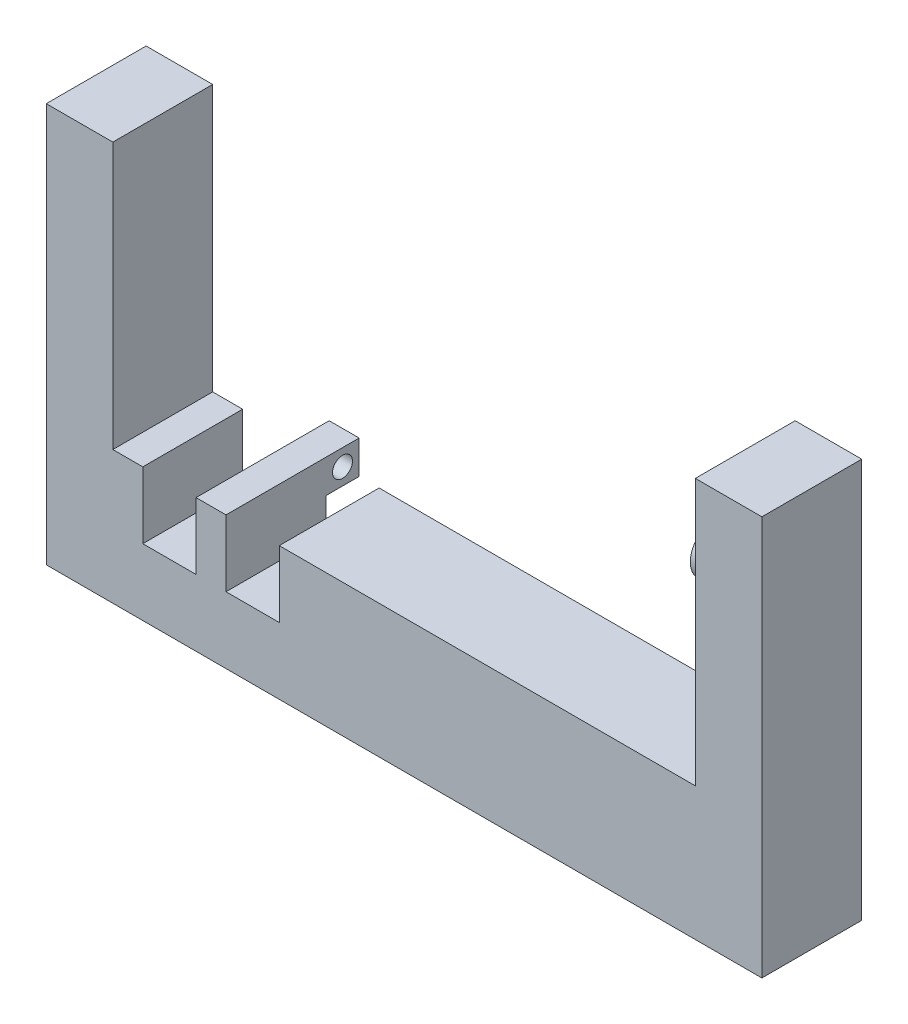
ISO-10303-21;
HEADER;
FILE_DESCRIPTION(('STEP AP214'),'2;1');
FILE_NAME('part.step','',(''),(''),'','','');
FILE_SCHEMA(('AUTOMOTIVE_DESIGN { 1 0 10303 214 1 1 1 1 }'));
ENDSEC;
DATA;
#1=APPLICATION_CONTEXT('core data for automotive mechanical design processes');
#2=APPLICATION_PROTOCOL_DEFINITION('international standard','automotive_design',2000,#1);
#3=PRODUCT_CONTEXT('',#1,'mechanical');
#4=PRODUCT('Part','Part','',(#3));
#5=PRODUCT_RELATED_PRODUCT_CATEGORY('part','',(#4));
#6=PRODUCT_DEFINITION_FORMATION('','',#4);
#7=PRODUCT_DEFINITION_CONTEXT('part definition',#1,'design');
#8=PRODUCT_DEFINITION('design','',#6,#7);
#9=PRODUCT_DEFINITION_SHAPE('','',#8);
#10=(LENGTH_UNIT() NAMED_UNIT(*) SI_UNIT(.MILLI.,.METRE.));
#11=(NAMED_UNIT(*) PLANE_ANGLE_UNIT() SI_UNIT($,.RADIAN.));
#12=(NAMED_UNIT(*) SI_UNIT($,.STERADIAN.) SOLID_ANGLE_UNIT());
#13=UNCERTAINTY_MEASURE_WITH_UNIT(LENGTH_MEASURE(1.E-05),#10,'distance_accuracy_value','');
#14=(GEOMETRIC_REPRESENTATION_CONTEXT(3) GLOBAL_UNCERTAINTY_ASSIGNED_CONTEXT((#13)) GLOBAL_UNIT_ASSIGNED_CONTEXT((#10,
#11,#12)) REPRESENTATION_CONTEXT('',''));
#15=CARTESIAN_POINT('',(0.,0.,0.));
#16=DIRECTION('',(0.,0.,1.));
#17=DIRECTION('',(1.,0.,0.));
#18=AXIS2_PLACEMENT_3D('',#15,#16,#17);
#19=CARTESIAN_POINT('',(-103.,10.,-7.5));
#20=DIRECTION('',(0.,0.,-1.));
#21=DIRECTION('',(1.,0.,0.));
#22=AXIS2_PLACEMENT_3D('',#19,#20,#21);
#23=PLANE('',#22);
#24=DIRECTION('',(1.,0.,0.));
#25=VECTOR('',#24,1.);
#26=CARTESIAN_POINT('',(-136.5,15.,-7.5));
#27=LINE('',#26,#25);
#28=CARTESIAN_POINT('',(-136.5,15.,-7.5));
#29=VERTEX_POINT('',#28);
#30=CARTESIAN_POINT('',(-132.,15.,-7.5));
#31=VERTEX_POINT('',#30);
#32=EDGE_CURVE('E226',#29,#31,#27,.T.);
#33=ORIENTED_EDGE('',*,*,#32,.T.);
#34=DIRECTION('',(0.,-1.,0.));
#35=VECTOR('',#34,1.);
#36=CARTESIAN_POINT('',(-132.,20.,-7.5));
#37=LINE('',#36,#35);
#38=CARTESIAN_POINT('',(-132.,10.,-7.5));
#39=VERTEX_POINT('',#38);
#40=EDGE_CURVE('E295',#31,#39,#37,.T.);
#41=ORIENTED_EDGE('',*,*,#40,.T.);
#42=DIRECTION('',(-1.,0.,0.));
#43=VECTOR('',#42,1.);
#44=CARTESIAN_POINT('',(-103.,10.,-7.5));
#45=LINE('',#44,#43);
#46=CARTESIAN_POINT('',(-124.,10.,-7.5));
#47=VERTEX_POINT('',#46);
#48=EDGE_CURVE('E273',#47,#39,#45,.T.);
#49=ORIENTED_EDGE('',*,*,#48,.F.);
#50=DIRECTION('',(0.,-1.,0.));
#51=VECTOR('',#50,1.);
#52=CARTESIAN_POINT('',(-124.,20.,-7.5));
#53=LINE('',#52,#51);
#54=CARTESIAN_POINT('',(-124.,20.,-7.5));
#55=VERTEX_POINT('',#54);
#56=EDGE_CURVE('E270',#55,#47,#53,.T.);
#57=ORIENTED_EDGE('',*,*,#56,.F.);
#58=DIRECTION('',(-1.,0.,0.));
#59=VECTOR('',#58,1.);
#60=CARTESIAN_POINT('',(-103.,20.,-7.5));
#61=LINE('',#60,#59);
#62=CARTESIAN_POINT('',(-61.5,20.,-7.5));
#63=VERTEX_POINT('',#62);
#64=EDGE_CURVE('E259',#63,#55,#61,.T.);
#65=ORIENTED_EDGE('',*,*,#64,.F.);
#66=DIRECTION('',(0.,-1.,0.));
#67=VECTOR('',#66,1.);
#68=CARTESIAN_POINT('',(-61.5,60.,-7.5));
#69=LINE('',#68,#67);
#70=CARTESIAN_POINT('',(-61.5,60.,-7.5));
#71=VERTEX_POINT('',#70);
#72=EDGE_CURVE('E202',#71,#63,#69,.T.);
#73=ORIENTED_EDGE('',*,*,#72,.F.);
#74=DIRECTION('',(1.,0.,0.));
#75=VECTOR('',#74,1.);
#76=CARTESIAN_POINT('',(-103.,60.,-7.5));
#77=LINE('',#76,#75);
#78=CARTESIAN_POINT('',(-51.5,60.,-7.5));
#79=VERTEX_POINT('',#78);
#80=EDGE_CURVE('E316',#71,#79,#77,.T.);
#81=ORIENTED_EDGE('',*,*,#80,.T.);
#82=DIRECTION('',(0.,-1.,0.));
#83=VECTOR('',#82,1.);
#84=CARTESIAN_POINT('',(-51.5,60.,-7.5));
#85=LINE('',#84,#83);
#86=CARTESIAN_POINT('',(-51.5,0.,-7.5));
#87=VERTEX_POINT('',#86);
#88=EDGE_CURVE('E179',#79,#87,#85,.T.);
#89=ORIENTED_EDGE('',*,*,#88,.T.);
#90=DIRECTION('',(-1.,0.,0.));
#91=VECTOR('',#90,1.);
#92=CARTESIAN_POINT('',(-103.,0.,-7.5));
#93=LINE('',#92,#91);
#94=CARTESIAN_POINT('',(-159.,0.,-7.5));
#95=VERTEX_POINT('',#94);
#96=EDGE_CURVE('E298',#87,#95,#93,.T.);
#97=ORIENTED_EDGE('',*,*,#96,.T.);
#98=DIRECTION('',(0.,-1.,0.));
#99=VECTOR('',#98,1.);
#100=CARTESIAN_POINT('',(-159.,60.,-7.5));
#101=LINE('',#100,#99);
#102=CARTESIAN_POINT('',(-159.,60.,-7.5));
#103=VERTEX_POINT('',#102);
#104=EDGE_CURVE('E221',#103,#95,#101,.T.);
#105=ORIENTED_EDGE('',*,*,#104,.F.);
#106=DIRECTION('',(-1.,0.,0.));
#107=VECTOR('',#106,1.);
#108=CARTESIAN_POINT('',(-103.,60.,-7.50000000000001));
#109=LINE('',#108,#107);
#110=CARTESIAN_POINT('',(-149.,60.,-7.5));
#111=VERTEX_POINT('',#110);
#112=EDGE_CURVE('E210',#111,#103,#109,.T.);
#113=ORIENTED_EDGE('',*,*,#112,.F.);
#114=DIRECTION('',(0.,-1.,0.));
#115=VECTOR('',#114,1.);
#116=CARTESIAN_POINT('',(-149.,60.,-7.5));
#117=LINE('',#116,#115);
#118=CARTESIAN_POINT('',(-149.,20.,-7.5));
#119=VERTEX_POINT('',#118);
#120=EDGE_CURVE('E218',#111,#119,#117,.T.);
#121=ORIENTED_EDGE('',*,*,#120,.T.);
#122=DIRECTION('',(-1.,0.,0.));
#123=VECTOR('',#122,1.);
#124=CARTESIAN_POINT('',(-103.,20.,-7.49999999999995));
#125=LINE('',#124,#123);
#126=CARTESIAN_POINT('',(-144.5,20.,-7.5));
#127=VERTEX_POINT('',#126);
#128=EDGE_CURVE('E246',#127,#119,#125,.T.);
#129=ORIENTED_EDGE('',*,*,#128,.F.);
#130=DIRECTION('',(0.,-1.,0.));
#131=VECTOR('',#130,1.);
#132=CARTESIAN_POINT('',(-144.5,20.,-7.5));
#133=LINE('',#132,#131);
#134=CARTESIAN_POINT('',(-144.5,10.,-7.5));
#135=VERTEX_POINT('',#134);
#136=EDGE_CURVE('E254',#127,#135,#133,.T.);
#137=ORIENTED_EDGE('',*,*,#136,.T.);
#138=DIRECTION('',(-1.,0.,0.));
#139=VECTOR('',#138,1.);
#140=CARTESIAN_POINT('',(-103.,10.,-7.5));
#141=LINE('',#140,#139);
#142=CARTESIAN_POINT('',(-136.5,10.,-7.5));
#143=VERTEX_POINT('',#142);
#144=EDGE_CURVE('E301',#143,#135,#141,.T.);
#145=ORIENTED_EDGE('',*,*,#144,.F.);
#146=DIRECTION('',(0.,-1.,0.));
#147=VECTOR('',#146,1.);
#148=CARTESIAN_POINT('',(-136.5,20.,-7.5));
#149=LINE('',#148,#147);
#150=EDGE_CURVE('E288',#29,#143,#149,.T.);
#151=ORIENTED_EDGE('',*,*,#150,.F.);
#152=EDGE_LOOP('',(#33,#41,#49,#57,#65,#73,#81,#89,#97,#105,#113,#121,#129,#137,#145,#151));
#153=FACE_BOUND('',#152,.T.);
#154=ADVANCED_FACE('F43',(#153),#23,.T.);
#155=CARTESIAN_POINT('',(-103.,10.,7.5));
#156=DIRECTION('',(0.,0.,-1.));
#157=DIRECTION('',(1.,0.,0.));
#158=AXIS2_PLACEMENT_3D('',#155,#156,#157);
#159=PLANE('',#158);
#160=DIRECTION('',(-1.,0.,0.));
#161=VECTOR('',#160,1.);
#162=CARTESIAN_POINT('',(-103.,0.,7.5));
#163=LINE('',#162,#161);
#164=CARTESIAN_POINT('',(-51.5,0.,7.5));
#165=VERTEX_POINT('',#164);
#166=CARTESIAN_POINT('',(-159.,0.,7.5));
#167=VERTEX_POINT('',#166);
#168=EDGE_CURVE('E196',#165,#167,#163,.T.);
#169=ORIENTED_EDGE('',*,*,#168,.F.);
#170=DIRECTION('',(0.,-1.,0.));
#171=VECTOR('',#170,1.);
#172=CARTESIAN_POINT('',(-51.5,60.,7.5));
#173=LINE('',#172,#171);
#174=CARTESIAN_POINT('',(-51.5,60.,7.5));
#175=VERTEX_POINT('',#174);
#176=EDGE_CURVE('E176',#175,#165,#173,.T.);
#177=ORIENTED_EDGE('',*,*,#176,.F.);
#178=DIRECTION('',(-1.,0.,0.));
#179=VECTOR('',#178,1.);
#180=CARTESIAN_POINT('',(-103.,60.,7.5));
#181=LINE('',#180,#179);
#182=CARTESIAN_POINT('',(-61.5,60.,7.5));
#183=VERTEX_POINT('',#182);
#184=EDGE_CURVE('E183',#175,#183,#181,.T.);
#185=ORIENTED_EDGE('',*,*,#184,.T.);
#186=DIRECTION('',(0.,-1.,0.));
#187=VECTOR('',#186,1.);
#188=CARTESIAN_POINT('',(-61.5,60.,7.5));
#189=LINE('',#188,#187);
#190=CARTESIAN_POINT('',(-61.5,20.,7.5));
#191=VERTEX_POINT('',#190);
#192=EDGE_CURVE('E198',#183,#191,#189,.T.);
#193=ORIENTED_EDGE('',*,*,#192,.T.);
#194=DIRECTION('',(-1.,0.,0.));
#195=VECTOR('',#194,1.);
#196=CARTESIAN_POINT('',(-103.,20.,7.5));
#197=LINE('',#196,#195);
#198=CARTESIAN_POINT('',(-124.,20.,7.5));
#199=VERTEX_POINT('',#198);
#200=EDGE_CURVE('E264',#191,#199,#197,.T.);
#201=ORIENTED_EDGE('',*,*,#200,.T.);
#202=DIRECTION('',(0.,-1.,0.));
#203=VECTOR('',#202,1.);
#204=CARTESIAN_POINT('',(-124.,20.,7.5));
#205=LINE('',#204,#203);
#206=CARTESIAN_POINT('',(-124.,10.,7.5));
#207=VERTEX_POINT('',#206);
#208=EDGE_CURVE('E267',#199,#207,#205,.T.);
#209=ORIENTED_EDGE('',*,*,#208,.T.);
#210=DIRECTION('',(-1.,0.,0.));
#211=VECTOR('',#210,1.);
#212=CARTESIAN_POINT('',(-103.,10.,7.5));
#213=LINE('',#212,#211);
#214=CARTESIAN_POINT('',(-132.,10.,7.5));
#215=VERTEX_POINT('',#214);
#216=EDGE_CURVE('E277',#207,#215,#213,.T.);
#217=ORIENTED_EDGE('',*,*,#216,.T.);
#218=DIRECTION('',(0.,-1.,0.));
#219=VECTOR('',#218,1.);
#220=CARTESIAN_POINT('',(-132.,20.,7.5));
#221=LINE('',#220,#219);
#222=CARTESIAN_POINT('',(-132.,20.,7.5));
#223=VERTEX_POINT('',#222);
#224=EDGE_CURVE('E293',#223,#215,#221,.T.);
#225=ORIENTED_EDGE('',*,*,#224,.F.);
#226=DIRECTION('',(-1.,0.,0.));
#227=VECTOR('',#226,1.);
#228=CARTESIAN_POINT('',(-103.,20.,7.5));
#229=LINE('',#228,#227);
#230=CARTESIAN_POINT('',(-136.5,20.,7.5));
#231=VERTEX_POINT('',#230);
#232=EDGE_CURVE('E283',#223,#231,#229,.T.);
#233=ORIENTED_EDGE('',*,*,#232,.T.);
#234=DIRECTION('',(0.,-1.,0.));
#235=VECTOR('',#234,1.);
#236=CARTESIAN_POINT('',(-136.5,20.,7.5));
#237=LINE('',#236,#235);
#238=CARTESIAN_POINT('',(-136.5,10.,7.5));
#239=VERTEX_POINT('',#238);
#240=EDGE_CURVE('E290',#231,#239,#237,.T.);
#241=ORIENTED_EDGE('',*,*,#240,.T.);
#242=DIRECTION('',(-1.,0.,0.));
#243=VECTOR('',#242,1.);
#244=CARTESIAN_POINT('',(-103.,10.,7.5));
#245=LINE('',#244,#243);
#246=CARTESIAN_POINT('',(-144.5,10.,7.5));
#247=VERTEX_POINT('',#246);
#248=EDGE_CURVE('E11',#239,#247,#245,.T.);
#249=ORIENTED_EDGE('',*,*,#248,.T.);
#250=DIRECTION('',(0.,-1.,0.));
#251=VECTOR('',#250,1.);
#252=CARTESIAN_POINT('',(-144.5,20.,7.5));
#253=LINE('',#252,#251);
#254=CARTESIAN_POINT('',(-144.5,20.,7.5));
#255=VERTEX_POINT('',#254);
#256=EDGE_CURVE('E251',#255,#247,#253,.T.);
#257=ORIENTED_EDGE('',*,*,#256,.F.);
#258=DIRECTION('',(1.,0.,0.));
#259=VECTOR('',#258,1.);
#260=CARTESIAN_POINT('',(-103.,20.,7.5));
#261=LINE('',#260,#259);
#262=CARTESIAN_POINT('',(-149.,20.,7.5));
#263=VERTEX_POINT('',#262);
#264=EDGE_CURVE('E241',#263,#255,#261,.T.);
#265=ORIENTED_EDGE('',*,*,#264,.F.);
#266=DIRECTION('',(0.,-1.,0.));
#267=VECTOR('',#266,1.);
#268=CARTESIAN_POINT('',(-149.,60.,7.5));
#269=LINE('',#268,#267);
#270=CARTESIAN_POINT('',(-149.,60.,7.5));
#271=VERTEX_POINT('',#270);
#272=EDGE_CURVE('E214',#271,#263,#269,.T.);
#273=ORIENTED_EDGE('',*,*,#272,.F.);
#274=DIRECTION('',(1.,0.,0.));
#275=VECTOR('',#274,1.);
#276=CARTESIAN_POINT('',(-103.,60.,7.50000000000001));
#277=LINE('',#276,#275);
#278=CARTESIAN_POINT('',(-159.,60.,7.5));
#279=VERTEX_POINT('',#278);
#280=EDGE_CURVE('E200',#279,#271,#277,.T.);
#281=ORIENTED_EDGE('',*,*,#280,.F.);
#282=DIRECTION('',(0.,-1.,0.));
#283=VECTOR('',#282,1.);
#284=CARTESIAN_POINT('',(-159.,60.,7.5));
#285=LINE('',#284,#283);
#286=EDGE_CURVE('E224',#279,#167,#285,.T.);
#287=ORIENTED_EDGE('',*,*,#286,.T.);
#288=EDGE_LOOP('',(#169,#177,#185,#193,#201,#209,#217,#225,#233,#241,#249,#257,#265,#273,#281,#287));
#289=FACE_BOUND('',#288,.T.);
#290=ADVANCED_FACE('F193',(#289),#159,.F.);
#291=CARTESIAN_POINT('',(-103.,10.,0.));
#292=DIRECTION('',(0.,1.,0.));
#293=DIRECTION('',(0.,0.,1.));
#294=AXIS2_PLACEMENT_3D('',#291,#292,#293);
#295=PLANE('',#294);
#296=DIRECTION('',(0.,0.,1.));
#297=VECTOR('',#296,1.);
#298=CARTESIAN_POINT('',(-144.5,10.,0.));
#299=LINE('',#298,#297);
#300=EDGE_CURVE('E299',#135,#247,#299,.T.);
#301=ORIENTED_EDGE('',*,*,#300,.T.);
#302=ORIENTED_EDGE('',*,*,#248,.F.);
#303=DIRECTION('',(0.,0.,1.));
#304=VECTOR('',#303,1.);
#305=CARTESIAN_POINT('',(-136.5,10.,0.));
#306=LINE('',#305,#304);
#307=EDGE_CURVE('E51',#143,#239,#306,.T.);
#308=ORIENTED_EDGE('',*,*,#307,.F.);
#309=ORIENTED_EDGE('',*,*,#144,.T.);
#310=EDGE_LOOP('',(#301,#302,#308,#309));
#311=FACE_BOUND('',#310,.T.);
#312=ADVANCED_FACE('F349',(#311),#295,.T.);
#313=CARTESIAN_POINT('',(-103.,0.,0.));
#314=DIRECTION('',(0.,1.,0.));
#315=DIRECTION('',(0.,0.,1.));
#316=AXIS2_PLACEMENT_3D('',#313,#314,#315);
#317=PLANE('',#316);
#318=ORIENTED_EDGE('',*,*,#96,.F.);
#319=DIRECTION('',(0.,0.,1.));
#320=VECTOR('',#319,1.);
#321=CARTESIAN_POINT('',(-51.5,0.,0.));
#322=LINE('',#321,#320);
#323=EDGE_CURVE('E184',#87,#165,#322,.T.);
#324=ORIENTED_EDGE('',*,*,#323,.T.);
#325=ORIENTED_EDGE('',*,*,#168,.T.);
#326=DIRECTION('',(0.,0.,1.));
#327=VECTOR('',#326,1.);
#328=CARTESIAN_POINT('',(-159.,0.,0.));
#329=LINE('',#328,#327);
#330=EDGE_CURVE('E197',#95,#167,#329,.T.);
#331=ORIENTED_EDGE('',*,*,#330,.F.);
#332=EDGE_LOOP('',(#318,#324,#325,#331));
#333=FACE_BOUND('',#332,.T.);
#334=ADVANCED_FACE('F308',(#333),#317,.F.);
#335=CARTESIAN_POINT('',(-136.5,20.,0.));
#336=DIRECTION('',(-1.,0.,0.));
#337=DIRECTION('',(0.,0.,-1.));
#338=AXIS2_PLACEMENT_3D('',#335,#336,#337);
#339=PLANE('',#338);
#340=CARTESIAN_POINT('',(-136.5,17.5,-10.));
#341=DIRECTION('',(1.,0.,0.));
#342=DIRECTION('',(0.,0.,-1.));
#343=AXIS2_PLACEMENT_3D('',#340,#341,#342);
#344=CIRCLE('',#343,1.5);
#345=CARTESIAN_POINT('',(-136.5,17.5,-11.5));
#346=VERTEX_POINT('',#345);
#347=EDGE_CURVE('E368',#346,#346,#344,.T.);
#348=ORIENTED_EDGE('',*,*,#347,.T.);
#349=EDGE_LOOP('',(#348));
#350=FACE_BOUND('',#349,.T.);
#351=ORIENTED_EDGE('',*,*,#307,.T.);
#352=ORIENTED_EDGE('',*,*,#240,.F.);
#353=DIRECTION('',(0.,0.,1.));
#354=VECTOR('',#353,1.);
#355=CARTESIAN_POINT('',(-136.5,20.,0.));
#356=LINE('',#355,#354);
#357=CARTESIAN_POINT('',(-136.5,20.,-12.5));
#358=VERTEX_POINT('',#357);
#359=EDGE_CURVE('E286',#358,#231,#356,.T.);
#360=ORIENTED_EDGE('',*,*,#359,.F.);
#361=DIRECTION('',(0.,-1.,0.));
#362=VECTOR('',#361,1.);
#363=CARTESIAN_POINT('',(-136.5,20.,-12.5));
#364=LINE('',#363,#362);
#365=CARTESIAN_POINT('',(-136.5,15.,-12.5));
#366=VERTEX_POINT('',#365);
#367=EDGE_CURVE('E227',#358,#366,#364,.T.);
#368=ORIENTED_EDGE('',*,*,#367,.T.);
#369=DIRECTION('',(0.,0.,1.));
#370=VECTOR('',#369,1.);
#371=CARTESIAN_POINT('',(-136.5,15.,-12.5));
#372=LINE('',#371,#370);
#373=EDGE_CURVE('E59',#366,#29,#372,.T.);
#374=ORIENTED_EDGE('',*,*,#373,.T.);
#375=ORIENTED_EDGE('',*,*,#150,.T.);
#376=EDGE_LOOP('',(#351,#352,#360,#368,#374,#375));
#377=FACE_BOUND('',#376,.T.);
#378=ADVANCED_FACE('F357',(#350,#377),#339,.T.);
#379=CARTESIAN_POINT('',(-132.,20.,0.));
#380=DIRECTION('',(-1.,0.,0.));
#381=DIRECTION('',(0.,0.,-1.));
#382=AXIS2_PLACEMENT_3D('',#379,#380,#381);
#383=PLANE('',#382);
#384=CARTESIAN_POINT('',(-132.,17.5,-10.));
#385=DIRECTION('',(1.,0.,0.));
#386=DIRECTION('',(0.,0.,-1.));
#387=AXIS2_PLACEMENT_3D('',#384,#385,#386);
#388=CIRCLE('',#387,1.5);
#389=CARTESIAN_POINT('',(-132.,17.5,-11.5));
#390=VERTEX_POINT('',#389);
#391=EDGE_CURVE('E46',#390,#390,#388,.T.);
#392=ORIENTED_EDGE('',*,*,#391,.F.);
#393=EDGE_LOOP('',(#392));
#394=FACE_BOUND('',#393,.T.);
#395=DIRECTION('',(0.,0.,1.));
#396=VECTOR('',#395,1.);
#397=CARTESIAN_POINT('',(-132.,20.,0.));
#398=LINE('',#397,#396);
#399=CARTESIAN_POINT('',(-132.,20.,-12.5));
#400=VERTEX_POINT('',#399);
#401=EDGE_CURVE('E281',#400,#223,#398,.T.);
#402=ORIENTED_EDGE('',*,*,#401,.T.);
#403=ORIENTED_EDGE('',*,*,#224,.T.);
#404=DIRECTION('',(0.,0.,1.));
#405=VECTOR('',#404,1.);
#406=CARTESIAN_POINT('',(-132.,10.,0.));
#407=LINE('',#406,#405);
#408=EDGE_CURVE('E67',#39,#215,#407,.T.);
#409=ORIENTED_EDGE('',*,*,#408,.F.);
#410=ORIENTED_EDGE('',*,*,#40,.F.);
#411=DIRECTION('',(0.,0.,1.));
#412=VECTOR('',#411,1.);
#413=CARTESIAN_POINT('',(-132.,15.,-12.5));
#414=LINE('',#413,#412);
#415=CARTESIAN_POINT('',(-132.,15.,-12.5));
#416=VERTEX_POINT('',#415);
#417=EDGE_CURVE('E236',#416,#31,#414,.T.);
#418=ORIENTED_EDGE('',*,*,#417,.F.);
#419=DIRECTION('',(0.,1.,0.));
#420=VECTOR('',#419,1.);
#421=CARTESIAN_POINT('',(-132.,20.,-12.5));
#422=LINE('',#421,#420);
#423=EDGE_CURVE('E231',#416,#400,#422,.T.);
#424=ORIENTED_EDGE('',*,*,#423,.T.);
#425=EDGE_LOOP('',(#402,#403,#409,#410,#418,#424));
#426=FACE_BOUND('',#425,.T.);
#427=ADVANCED_FACE('F342',(#394,#426),#383,.F.);
#428=CARTESIAN_POINT('',(-103.,20.,0.));
#429=DIRECTION('',(0.,1.,0.));
#430=DIRECTION('',(0.,0.,1.));
#431=AXIS2_PLACEMENT_3D('',#428,#429,#430);
#432=PLANE('',#431);
#433=ORIENTED_EDGE('',*,*,#359,.T.);
#434=ORIENTED_EDGE('',*,*,#232,.F.);
#435=ORIENTED_EDGE('',*,*,#401,.F.);
#436=DIRECTION('',(-1.,0.,0.));
#437=VECTOR('',#436,1.);
#438=CARTESIAN_POINT('',(-136.5,20.,-12.5));
#439=LINE('',#438,#437);
#440=EDGE_CURVE('E234',#400,#358,#439,.T.);
#441=ORIENTED_EDGE('',*,*,#440,.T.);
#442=EDGE_LOOP('',(#433,#434,#435,#441));
#443=FACE_BOUND('',#442,.T.);
#444=ADVANCED_FACE('F335',(#443),#432,.T.);
#445=CARTESIAN_POINT('',(-103.,10.,0.));
#446=DIRECTION('',(0.,1.,0.));
#447=DIRECTION('',(0.,0.,1.));
#448=AXIS2_PLACEMENT_3D('',#445,#446,#447);
#449=PLANE('',#448);
#450=ORIENTED_EDGE('',*,*,#48,.T.);
#451=ORIENTED_EDGE('',*,*,#408,.T.);
#452=ORIENTED_EDGE('',*,*,#216,.F.);
#453=DIRECTION('',(0.,0.,1.));
#454=VECTOR('',#453,1.);
#455=CARTESIAN_POINT('',(-124.,10.,0.));
#456=LINE('',#455,#454);
#457=EDGE_CURVE('E275',#47,#207,#456,.T.);
#458=ORIENTED_EDGE('',*,*,#457,.F.);
#459=EDGE_LOOP('',(#450,#451,#452,#458));
#460=FACE_BOUND('',#459,.T.);
#461=ADVANCED_FACE('F333',(#460),#449,.T.);
#462=CARTESIAN_POINT('',(-124.,20.,0.));
#463=DIRECTION('',(-1.,0.,0.));
#464=DIRECTION('',(0.,0.,-1.));
#465=AXIS2_PLACEMENT_3D('',#462,#463,#464);
#466=PLANE('',#465);
#467=ORIENTED_EDGE('',*,*,#457,.T.);
#468=ORIENTED_EDGE('',*,*,#208,.F.);
#469=DIRECTION('',(0.,0.,1.));
#470=VECTOR('',#469,1.);
#471=CARTESIAN_POINT('',(-124.,20.,0.));
#472=LINE('',#471,#470);
#473=EDGE_CURVE('E257',#55,#199,#472,.T.);
#474=ORIENTED_EDGE('',*,*,#473,.F.);
#475=ORIENTED_EDGE('',*,*,#56,.T.);
#476=EDGE_LOOP('',(#467,#468,#474,#475));
#477=FACE_BOUND('',#476,.T.);
#478=ADVANCED_FACE('F332',(#477),#466,.T.);
#479=CARTESIAN_POINT('',(-103.,20.,0.));
#480=DIRECTION('',(0.,1.,0.));
#481=DIRECTION('',(0.,0.,1.));
#482=AXIS2_PLACEMENT_3D('',#479,#480,#481);
#483=PLANE('',#482);
#484=ORIENTED_EDGE('',*,*,#473,.T.);
#485=ORIENTED_EDGE('',*,*,#200,.F.);
#486=DIRECTION('',(0.,0.,1.));
#487=VECTOR('',#486,1.);
#488=CARTESIAN_POINT('',(-61.5,20.,0.));
#489=LINE('',#488,#487);
#490=EDGE_CURVE('E262',#63,#191,#489,.T.);
#491=ORIENTED_EDGE('',*,*,#490,.F.);
#492=ORIENTED_EDGE('',*,*,#64,.T.);
#493=EDGE_LOOP('',(#484,#485,#491,#492));
#494=FACE_BOUND('',#493,.T.);
#495=ADVANCED_FACE('F328',(#494),#483,.T.);
#496=CARTESIAN_POINT('',(-144.5,20.,0.));
#497=DIRECTION('',(-1.,0.,0.));
#498=DIRECTION('',(0.,0.,-1.));
#499=AXIS2_PLACEMENT_3D('',#496,#497,#498);
#500=PLANE('',#499);
#501=ORIENTED_EDGE('',*,*,#136,.F.);
#502=DIRECTION('',(0.,0.,1.));
#503=VECTOR('',#502,1.);
#504=CARTESIAN_POINT('',(-144.5,20.,0.));
#505=LINE('',#504,#503);
#506=EDGE_CURVE('E249',#127,#255,#505,.T.);
#507=ORIENTED_EDGE('',*,*,#506,.T.);
#508=ORIENTED_EDGE('',*,*,#256,.T.);
#509=ORIENTED_EDGE('',*,*,#300,.F.);
#510=EDGE_LOOP('',(#501,#507,#508,#509));
#511=FACE_BOUND('',#510,.T.);
#512=ADVANCED_FACE('F388',(#511),#500,.F.);
#513=CARTESIAN_POINT('',(-103.,20.,0.));
#514=DIRECTION('',(0.,1.,0.));
#515=DIRECTION('',(0.,0.,1.));
#516=AXIS2_PLACEMENT_3D('',#513,#514,#515);
#517=PLANE('',#516);
#518=ORIENTED_EDGE('',*,*,#264,.T.);
#519=ORIENTED_EDGE('',*,*,#506,.F.);
#520=ORIENTED_EDGE('',*,*,#128,.T.);
#521=DIRECTION('',(0.,0.,1.));
#522=VECTOR('',#521,1.);
#523=CARTESIAN_POINT('',(-149.,20.,0.));
#524=LINE('',#523,#522);
#525=EDGE_CURVE('E244',#119,#263,#524,.T.);
#526=ORIENTED_EDGE('',*,*,#525,.T.);
#527=EDGE_LOOP('',(#518,#519,#520,#526));
#528=FACE_BOUND('',#527,.T.);
#529=ADVANCED_FACE('F393',(#528),#517,.T.);
#530=CARTESIAN_POINT('',(-136.5,15.,-12.5));
#531=DIRECTION('',(0.,1.,0.));
#532=DIRECTION('',(0.,0.,1.));
#533=AXIS2_PLACEMENT_3D('',#530,#531,#532);
#534=PLANE('',#533);
#535=ORIENTED_EDGE('',*,*,#32,.F.);
#536=ORIENTED_EDGE('',*,*,#373,.F.);
#537=DIRECTION('',(1.,0.,0.));
#538=VECTOR('',#537,1.);
#539=CARTESIAN_POINT('',(-136.5,15.,-12.5));
#540=LINE('',#539,#538);
#541=EDGE_CURVE('E229',#366,#416,#540,.T.);
#542=ORIENTED_EDGE('',*,*,#541,.T.);
#543=ORIENTED_EDGE('',*,*,#417,.T.);
#544=EDGE_LOOP('',(#535,#536,#542,#543));
#545=FACE_BOUND('',#544,.T.);
#546=ADVANCED_FACE('F383',(#545),#534,.F.);
#547=CARTESIAN_POINT('',(-103.,0.,-12.5));
#548=DIRECTION('',(0.,0.,-1.));
#549=DIRECTION('',(1.,0.,0.));
#550=AXIS2_PLACEMENT_3D('',#547,#548,#549);
#551=PLANE('',#550);
#552=ORIENTED_EDGE('',*,*,#367,.F.);
#553=ORIENTED_EDGE('',*,*,#440,.F.);
#554=ORIENTED_EDGE('',*,*,#423,.F.);
#555=ORIENTED_EDGE('',*,*,#541,.F.);
#556=EDGE_LOOP('',(#552,#553,#554,#555));
#557=FACE_BOUND('',#556,.T.);
#558=ADVANCED_FACE('F378',(#557),#551,.T.);
#559=CARTESIAN_POINT('',(-149.,60.,0.));
#560=DIRECTION('',(-1.,0.,0.));
#561=DIRECTION('',(0.,0.,-1.));
#562=AXIS2_PLACEMENT_3D('',#559,#560,#561);
#563=PLANE('',#562);
#564=ORIENTED_EDGE('',*,*,#120,.F.);
#565=DIRECTION('',(0.,0.,1.));
#566=VECTOR('',#565,1.);
#567=CARTESIAN_POINT('',(-149.,60.,0.));
#568=LINE('',#567,#566);
#569=EDGE_CURVE('E213',#111,#271,#568,.T.);
#570=ORIENTED_EDGE('',*,*,#569,.T.);
#571=ORIENTED_EDGE('',*,*,#272,.T.);
#572=ORIENTED_EDGE('',*,*,#525,.F.);
#573=EDGE_LOOP('',(#564,#570,#571,#572));
#574=FACE_BOUND('',#573,.T.);
#575=ADVANCED_FACE('F396',(#574),#563,.F.);
#576=CARTESIAN_POINT('',(-159.,60.,0.));
#577=DIRECTION('',(-1.,0.,0.));
#578=DIRECTION('',(0.,0.,-1.));
#579=AXIS2_PLACEMENT_3D('',#576,#577,#578);
#580=PLANE('',#579);
#581=ORIENTED_EDGE('',*,*,#330,.T.);
#582=ORIENTED_EDGE('',*,*,#286,.F.);
#583=DIRECTION('',(0.,0.,1.));
#584=VECTOR('',#583,1.);
#585=CARTESIAN_POINT('',(-159.,60.,0.));
#586=LINE('',#585,#584);
#587=EDGE_CURVE('E208',#103,#279,#586,.T.);
#588=ORIENTED_EDGE('',*,*,#587,.F.);
#589=ORIENTED_EDGE('',*,*,#104,.T.);
#590=EDGE_LOOP('',(#581,#582,#588,#589));
#591=FACE_BOUND('',#590,.T.);
#592=ADVANCED_FACE('F402',(#591),#580,.T.);
#593=CARTESIAN_POINT('',(-103.,60.,0.));
#594=DIRECTION('',(0.,1.,0.));
#595=DIRECTION('',(0.,0.,1.));
#596=AXIS2_PLACEMENT_3D('',#593,#594,#595);
#597=PLANE('',#596);
#598=ORIENTED_EDGE('',*,*,#280,.T.);
#599=ORIENTED_EDGE('',*,*,#569,.F.);
#600=ORIENTED_EDGE('',*,*,#112,.T.);
#601=ORIENTED_EDGE('',*,*,#587,.T.);
#602=EDGE_LOOP('',(#598,#599,#600,#601));
#603=FACE_BOUND('',#602,.T.);
#604=ADVANCED_FACE('F399',(#603),#597,.T.);
#605=CARTESIAN_POINT('',(-61.5,60.,0.));
#606=DIRECTION('',(-1.,0.,0.));
#607=DIRECTION('',(0.,0.,-1.));
#608=AXIS2_PLACEMENT_3D('',#605,#606,#607);
#609=PLANE('',#608);
#610=CARTESIAN_POINT('',(-61.5,45.,0.));
#611=DIRECTION('',(1.,0.,0.));
#612=DIRECTION('',(0.,0.,-1.));
#613=AXIS2_PLACEMENT_3D('',#610,#611,#612);
#614=CIRCLE('',#613,3.75);
#615=CARTESIAN_POINT('',(-61.5,45.,-3.74999999999999));
#616=VERTEX_POINT('',#615);
#617=EDGE_CURVE('E312',#616,#616,#614,.T.);
#618=ORIENTED_EDGE('',*,*,#617,.T.);
#619=EDGE_LOOP('',(#618));
#620=FACE_BOUND('',#619,.T.);
#621=ORIENTED_EDGE('',*,*,#490,.T.);
#622=ORIENTED_EDGE('',*,*,#192,.F.);
#623=DIRECTION('',(0.,0.,1.));
#624=VECTOR('',#623,1.);
#625=CARTESIAN_POINT('',(-61.5,60.,0.));
#626=LINE('',#625,#624);
#627=EDGE_CURVE('E188',#71,#183,#626,.T.);
#628=ORIENTED_EDGE('',*,*,#627,.F.);
#629=ORIENTED_EDGE('',*,*,#72,.T.);
#630=EDGE_LOOP('',(#621,#622,#628,#629));
#631=FACE_BOUND('',#630,.T.);
#632=ADVANCED_FACE('F322',(#620,#631),#609,.T.);
#633=CARTESIAN_POINT('',(-51.5,60.,0.));
#634=DIRECTION('',(-1.,0.,0.));
#635=DIRECTION('',(0.,0.,-1.));
#636=AXIS2_PLACEMENT_3D('',#633,#634,#635);
#637=PLANE('',#636);
#638=ORIENTED_EDGE('',*,*,#323,.F.);
#639=ORIENTED_EDGE('',*,*,#88,.F.);
#640=DIRECTION('',(0.,0.,1.));
#641=VECTOR('',#640,1.);
#642=CARTESIAN_POINT('',(-51.5,60.,0.));
#643=LINE('',#642,#641);
#644=EDGE_CURVE('E172',#79,#175,#643,.T.);
#645=ORIENTED_EDGE('',*,*,#644,.T.);
#646=ORIENTED_EDGE('',*,*,#176,.T.);
#647=EDGE_LOOP('',(#638,#639,#645,#646));
#648=FACE_BOUND('',#647,.T.);
#649=ADVANCED_FACE('F174',(#648),#637,.F.);
#650=CARTESIAN_POINT('',(-103.,60.,0.));
#651=DIRECTION('',(0.,1.,0.));
#652=DIRECTION('',(0.,0.,1.));
#653=AXIS2_PLACEMENT_3D('',#650,#651,#652);
#654=PLANE('',#653);
#655=ORIENTED_EDGE('',*,*,#644,.F.);
#656=ORIENTED_EDGE('',*,*,#80,.F.);
#657=ORIENTED_EDGE('',*,*,#627,.T.);
#658=ORIENTED_EDGE('',*,*,#184,.F.);
#659=EDGE_LOOP('',(#655,#656,#657,#658));
#660=FACE_BOUND('',#659,.T.);
#661=ADVANCED_FACE('F187',(#660),#654,.T.);
#662=CARTESIAN_POINT('',(-66.,45.,0.));
#663=DIRECTION('',(1.,0.,0.));
#664=DIRECTION('',(0.,0.,1.));
#665=AXIS2_PLACEMENT_3D('',#662,#663,#664);
#666=CYLINDRICAL_SURFACE('',#665,3.75);
#667=CARTESIAN_POINT('',(-66.,45.,0.));
#668=DIRECTION('',(1.,0.,0.));
#669=DIRECTION('',(0.,0.,-1.));
#670=AXIS2_PLACEMENT_3D('',#667,#668,#669);
#671=CIRCLE('',#670,3.75);
#672=CARTESIAN_POINT('',(-66.,45.,-3.74999999999999));
#673=VERTEX_POINT('',#672);
#674=EDGE_CURVE('E309',#673,#673,#671,.T.);
#675=ORIENTED_EDGE('',*,*,#674,.T.);
#676=EDGE_LOOP('',(#675));
#677=FACE_BOUND('',#676,.T.);
#678=ORIENTED_EDGE('',*,*,#617,.F.);
#679=EDGE_LOOP('',(#678));
#680=FACE_BOUND('',#679,.T.);
#681=ADVANCED_FACE('F419',(#677,#680),#666,.T.);
#682=CARTESIAN_POINT('',(-66.,45.,0.));
#683=DIRECTION('',(-1.,0.,0.));
#684=DIRECTION('',(0.,0.,-1.));
#685=AXIS2_PLACEMENT_3D('',#682,#683,#684);
#686=PLANE('',#685);
#687=ORIENTED_EDGE('',*,*,#674,.F.);
#688=EDGE_LOOP('',(#687));
#689=FACE_BOUND('',#688,.T.);
#690=ADVANCED_FACE('F413',(#689),#686,.T.);
#691=CARTESIAN_POINT('',(-131.5,17.5,-10.));
#692=DIRECTION('',(-1.,0.,0.));
#693=DIRECTION('',(0.,0.,-1.));
#694=AXIS2_PLACEMENT_3D('',#691,#692,#693);
#695=CYLINDRICAL_SURFACE('',#694,1.5);
#696=ORIENTED_EDGE('',*,*,#347,.F.);
#697=EDGE_LOOP('',(#696));
#698=FACE_BOUND('',#697,.T.);
#699=ORIENTED_EDGE('',*,*,#391,.T.);
#700=EDGE_LOOP('',(#699));
#701=FACE_BOUND('',#700,.T.);
#702=ADVANCED_FACE('F410',(#698,#701),#695,.F.);
#703=CLOSED_SHELL('',(#154,#290,#312,#334,#378,#427,#444,#461,#478,#495,#512,#529,#546,#558,
#575,#592,#604,#632,#649,#661,#681,#690,#702));
#704=MANIFOLD_SOLID_BREP('B2',#703);
#705=ADVANCED_BREP_SHAPE_REPRESENTATION('',(#18,#704),#14);
#706=SHAPE_DEFINITION_REPRESENTATION(#9,#705);
ENDSEC;
END-ISO-10303-21;
